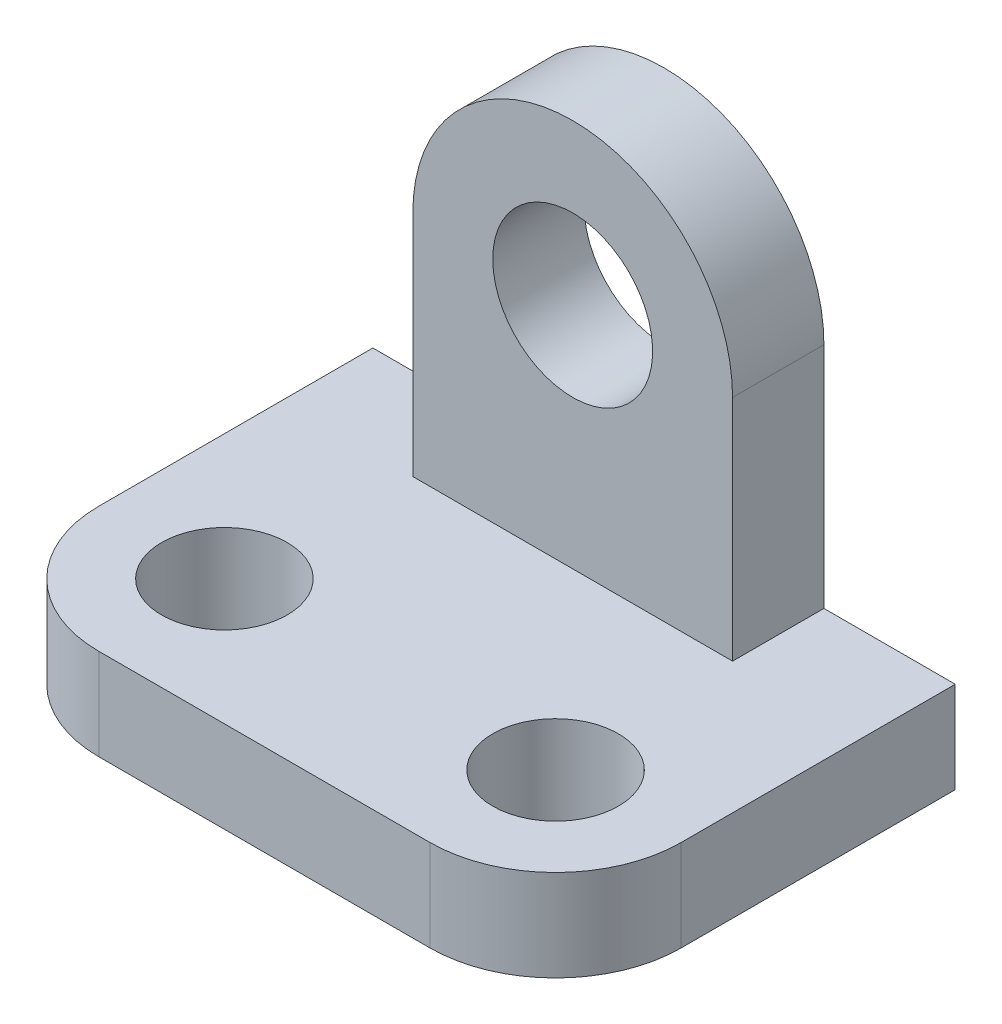
ISO-10303-21;
HEADER;
FILE_DESCRIPTION(('STEP AP214'),'2;1');
FILE_NAME('part.step','',(''),(''),'','','');
FILE_SCHEMA(('AUTOMOTIVE_DESIGN { 1 0 10303 214 1 1 1 1 }'));
ENDSEC;
DATA;
#1=APPLICATION_CONTEXT('core data for automotive mechanical design processes');
#2=APPLICATION_PROTOCOL_DEFINITION('international standard','automotive_design',2000,#1);
#3=PRODUCT_CONTEXT('',#1,'mechanical');
#4=PRODUCT('Part','Part','',(#3));
#5=PRODUCT_RELATED_PRODUCT_CATEGORY('part','',(#4));
#6=PRODUCT_DEFINITION_FORMATION('','',#4);
#7=PRODUCT_DEFINITION_CONTEXT('part definition',#1,'design');
#8=PRODUCT_DEFINITION('design','',#6,#7);
#9=PRODUCT_DEFINITION_SHAPE('','',#8);
#10=(LENGTH_UNIT() NAMED_UNIT(*) SI_UNIT(.MILLI.,.METRE.));
#11=(NAMED_UNIT(*) PLANE_ANGLE_UNIT() SI_UNIT($,.RADIAN.));
#12=(NAMED_UNIT(*) SI_UNIT($,.STERADIAN.) SOLID_ANGLE_UNIT());
#13=UNCERTAINTY_MEASURE_WITH_UNIT(LENGTH_MEASURE(1.E-05),#10,'distance_accuracy_value','');
#14=(GEOMETRIC_REPRESENTATION_CONTEXT(3) GLOBAL_UNCERTAINTY_ASSIGNED_CONTEXT((#13)) GLOBAL_UNIT_ASSIGNED_CONTEXT((#10,
#11,#12)) REPRESENTATION_CONTEXT('',''));
#15=CARTESIAN_POINT('',(0.,0.,0.));
#16=DIRECTION('',(0.,0.,1.));
#17=DIRECTION('',(1.,0.,0.));
#18=AXIS2_PLACEMENT_3D('',#15,#16,#17);
#19=CARTESIAN_POINT('',(-14.5,8.,6.50000000000002));
#20=DIRECTION('',(0.,-1.,0.));
#21=DIRECTION('',(0.,0.,-1.));
#22=AXIS2_PLACEMENT_3D('',#19,#20,#21);
#23=PLANE('',#22);
#24=CARTESIAN_POINT('',(-14.5,8.,6.49999999999995));
#25=DIRECTION('',(0.,1.,0.));
#26=DIRECTION('',(0.,0.,-1.));
#27=AXIS2_PLACEMENT_3D('',#24,#25,#26);
#28=CIRCLE('',#27,5.5);
#29=CARTESIAN_POINT('',(-14.5,8.,0.999999999999951));
#30=VERTEX_POINT('',#29);
#31=EDGE_CURVE('E266',#30,#30,#28,.T.);
#32=ORIENTED_EDGE('',*,*,#31,.F.);
#33=EDGE_LOOP('',(#32));
#34=FACE_BOUND('',#33,.T.);
#35=CARTESIAN_POINT('',(14.5,8.,6.49999999999995));
#36=DIRECTION('',(0.,1.,0.));
#37=DIRECTION('',(0.,0.,1.));
#38=AXIS2_PLACEMENT_3D('',#35,#36,#37);
#39=CIRCLE('',#38,5.49999999999999);
#40=CARTESIAN_POINT('',(14.5,8.,11.9999999999999));
#41=VERTEX_POINT('',#40);
#42=EDGE_CURVE('E153',#41,#41,#39,.T.);
#43=ORIENTED_EDGE('',*,*,#42,.F.);
#44=EDGE_LOOP('',(#43));
#45=FACE_BOUND('',#44,.T.);
#46=DIRECTION('',(0.,0.,-1.));
#47=VECTOR('',#46,1.);
#48=CARTESIAN_POINT('',(14.,8.,-9.49999999999999));
#49=LINE('',#48,#47);
#50=CARTESIAN_POINT('',(14.,8.,-9.49999999999999));
#51=VERTEX_POINT('',#50);
#52=CARTESIAN_POINT('',(14.,8.,-17.5));
#53=VERTEX_POINT('',#52);
#54=EDGE_CURVE('E201',#51,#53,#49,.T.);
#55=ORIENTED_EDGE('',*,*,#54,.F.);
#56=DIRECTION('',(-1.,0.,0.));
#57=VECTOR('',#56,1.);
#58=CARTESIAN_POINT('',(14.,8.,-9.49999999999999));
#59=LINE('',#58,#57);
#60=CARTESIAN_POINT('',(-14.,8.,-9.49999999999999));
#61=VERTEX_POINT('',#60);
#62=EDGE_CURVE('E235',#51,#61,#59,.T.);
#63=ORIENTED_EDGE('',*,*,#62,.T.);
#64=DIRECTION('',(0.,0.,-1.));
#65=VECTOR('',#64,1.);
#66=CARTESIAN_POINT('',(-14.,8.,-9.49999999999999));
#67=LINE('',#66,#65);
#68=CARTESIAN_POINT('',(-14.,8.,-17.5));
#69=VERTEX_POINT('',#68);
#70=EDGE_CURVE('E261',#61,#69,#67,.T.);
#71=ORIENTED_EDGE('',*,*,#70,.T.);
#72=DIRECTION('',(-1.,0.,0.));
#73=VECTOR('',#72,1.);
#74=CARTESIAN_POINT('',(-25.5,8.,-17.5));
#75=LINE('',#74,#73);
#76=CARTESIAN_POINT('',(-25.5,8.,-17.5));
#77=VERTEX_POINT('',#76);
#78=EDGE_CURVE('E188',#69,#77,#75,.T.);
#79=ORIENTED_EDGE('',*,*,#78,.T.);
#80=DIRECTION('',(0.,0.,1.));
#81=VECTOR('',#80,1.);
#82=CARTESIAN_POINT('',(-25.5,8.,6.50000000000002));
#83=LINE('',#82,#81);
#84=CARTESIAN_POINT('',(-25.5,8.,6.50000000000002));
#85=VERTEX_POINT('',#84);
#86=EDGE_CURVE('E123',#77,#85,#83,.T.);
#87=ORIENTED_EDGE('',*,*,#86,.T.);
#88=CARTESIAN_POINT('',(-14.5,8.,6.50000000000002));
#89=DIRECTION('',(0.,1.,0.));
#90=DIRECTION('',(0.,0.,-1.));
#91=AXIS2_PLACEMENT_3D('',#88,#89,#90);
#92=CIRCLE('',#91,11.);
#93=CARTESIAN_POINT('',(-14.5,8.,17.5));
#94=VERTEX_POINT('',#93);
#95=EDGE_CURVE('E116',#85,#94,#92,.T.);
#96=ORIENTED_EDGE('',*,*,#95,.T.);
#97=DIRECTION('',(1.,0.,0.));
#98=VECTOR('',#97,1.);
#99=CARTESIAN_POINT('',(-14.5,8.,17.5));
#100=LINE('',#99,#98);
#101=CARTESIAN_POINT('',(14.5,8.,17.5));
#102=VERTEX_POINT('',#101);
#103=EDGE_CURVE('E120',#94,#102,#100,.T.);
#104=ORIENTED_EDGE('',*,*,#103,.T.);
#105=CARTESIAN_POINT('',(14.5,8.,6.50000000000002));
#106=DIRECTION('',(0.,1.,0.));
#107=DIRECTION('',(0.,0.,1.));
#108=AXIS2_PLACEMENT_3D('',#105,#106,#107);
#109=CIRCLE('',#108,11.);
#110=CARTESIAN_POINT('',(25.5,8.,6.50000000000002));
#111=VERTEX_POINT('',#110);
#112=EDGE_CURVE('E70',#102,#111,#109,.T.);
#113=ORIENTED_EDGE('',*,*,#112,.T.);
#114=DIRECTION('',(0.,0.,-1.));
#115=VECTOR('',#114,1.);
#116=CARTESIAN_POINT('',(25.5,8.,6.50000000000002));
#117=LINE('',#116,#115);
#118=CARTESIAN_POINT('',(25.5,8.,-17.5));
#119=VERTEX_POINT('',#118);
#120=EDGE_CURVE('E166',#111,#119,#117,.T.);
#121=ORIENTED_EDGE('',*,*,#120,.T.);
#122=EDGE_CURVE('E105',#119,#53,#75,.T.);
#123=ORIENTED_EDGE('',*,*,#122,.T.);
#124=EDGE_LOOP('',(#55,#63,#71,#79,#87,#96,#104,#113,#121,#123));
#125=FACE_BOUND('',#124,.T.);
#126=ADVANCED_FACE('F45',(#34,#45,#125),#23,.F.);
#127=CARTESIAN_POINT('',(-14.5,0.,6.50000000000002));
#128=DIRECTION('',(0.,-1.,0.));
#129=DIRECTION('',(0.,0.,-1.));
#130=AXIS2_PLACEMENT_3D('',#127,#128,#129);
#131=PLANE('',#130);
#132=CARTESIAN_POINT('',(14.5,0.,6.49999999999995));
#133=DIRECTION('',(0.,1.,0.));
#134=DIRECTION('',(0.,0.,1.));
#135=AXIS2_PLACEMENT_3D('',#132,#133,#134);
#136=CIRCLE('',#135,5.49999999999999);
#137=CARTESIAN_POINT('',(14.5,0.,11.9999999999999));
#138=VERTEX_POINT('',#137);
#139=EDGE_CURVE('E193',#138,#138,#136,.T.);
#140=ORIENTED_EDGE('',*,*,#139,.T.);
#141=EDGE_LOOP('',(#140));
#142=FACE_BOUND('',#141,.T.);
#143=DIRECTION('',(0.,0.,-1.));
#144=VECTOR('',#143,1.);
#145=CARTESIAN_POINT('',(25.5,0.,6.50000000000002));
#146=LINE('',#145,#144);
#147=CARTESIAN_POINT('',(25.5,0.,6.50000000000002));
#148=VERTEX_POINT('',#147);
#149=CARTESIAN_POINT('',(25.5,0.,-17.5));
#150=VERTEX_POINT('',#149);
#151=EDGE_CURVE('E148',#148,#150,#146,.T.);
#152=ORIENTED_EDGE('',*,*,#151,.F.);
#153=CARTESIAN_POINT('',(14.5,0.,6.50000000000002));
#154=DIRECTION('',(0.,1.,0.));
#155=DIRECTION('',(0.,0.,1.));
#156=AXIS2_PLACEMENT_3D('',#153,#154,#155);
#157=CIRCLE('',#156,11.);
#158=CARTESIAN_POINT('',(14.5,0.,17.5));
#159=VERTEX_POINT('',#158);
#160=EDGE_CURVE('E97',#159,#148,#157,.T.);
#161=ORIENTED_EDGE('',*,*,#160,.F.);
#162=DIRECTION('',(1.,0.,0.));
#163=VECTOR('',#162,1.);
#164=CARTESIAN_POINT('',(-14.5,0.,17.5));
#165=LINE('',#164,#163);
#166=CARTESIAN_POINT('',(-14.5,0.,17.5));
#167=VERTEX_POINT('',#166);
#168=EDGE_CURVE('E161',#167,#159,#165,.T.);
#169=ORIENTED_EDGE('',*,*,#168,.F.);
#170=CARTESIAN_POINT('',(-14.5,0.,6.50000000000002));
#171=DIRECTION('',(0.,1.,0.));
#172=DIRECTION('',(0.,0.,-1.));
#173=AXIS2_PLACEMENT_3D('',#170,#171,#172);
#174=CIRCLE('',#173,11.);
#175=CARTESIAN_POINT('',(-25.5,0.,6.50000000000002));
#176=VERTEX_POINT('',#175);
#177=EDGE_CURVE('E133',#176,#167,#174,.T.);
#178=ORIENTED_EDGE('',*,*,#177,.F.);
#179=DIRECTION('',(0.,0.,1.));
#180=VECTOR('',#179,1.);
#181=CARTESIAN_POINT('',(-25.5,0.,6.50000000000002));
#182=LINE('',#181,#180);
#183=CARTESIAN_POINT('',(-25.5,0.,-17.5));
#184=VERTEX_POINT('',#183);
#185=EDGE_CURVE('E156',#184,#176,#182,.T.);
#186=ORIENTED_EDGE('',*,*,#185,.F.);
#187=DIRECTION('',(-1.,0.,0.));
#188=VECTOR('',#187,1.);
#189=CARTESIAN_POINT('',(-25.5,0.,-17.5));
#190=LINE('',#189,#188);
#191=EDGE_CURVE('E152',#150,#184,#190,.T.);
#192=ORIENTED_EDGE('',*,*,#191,.F.);
#193=EDGE_LOOP('',(#152,#161,#169,#178,#186,#192));
#194=FACE_BOUND('',#193,.T.);
#195=CARTESIAN_POINT('',(-14.5,0.,6.49999999999995));
#196=DIRECTION('',(0.,1.,0.));
#197=DIRECTION('',(0.,0.,-1.));
#198=AXIS2_PLACEMENT_3D('',#195,#196,#197);
#199=CIRCLE('',#198,5.5);
#200=CARTESIAN_POINT('',(-14.5,0.,0.999999999999951));
#201=VERTEX_POINT('',#200);
#202=EDGE_CURVE('E260',#201,#201,#199,.T.);
#203=ORIENTED_EDGE('',*,*,#202,.T.);
#204=EDGE_LOOP('',(#203));
#205=FACE_BOUND('',#204,.T.);
#206=ADVANCED_FACE('F181',(#142,#194,#205),#131,.T.);
#207=CARTESIAN_POINT('',(25.5,8.,6.50000000000002));
#208=DIRECTION('',(-1.,0.,0.));
#209=DIRECTION('',(0.,0.,1.));
#210=AXIS2_PLACEMENT_3D('',#207,#208,#209);
#211=PLANE('',#210);
#212=ORIENTED_EDGE('',*,*,#151,.T.);
#213=DIRECTION('',(0.,-1.,0.));
#214=VECTOR('',#213,1.);
#215=CARTESIAN_POINT('',(25.5,8.,-17.5));
#216=LINE('',#215,#214);
#217=EDGE_CURVE('E11',#119,#150,#216,.T.);
#218=ORIENTED_EDGE('',*,*,#217,.F.);
#219=ORIENTED_EDGE('',*,*,#120,.F.);
#220=DIRECTION('',(0.,-1.,0.));
#221=VECTOR('',#220,1.);
#222=CARTESIAN_POINT('',(25.5,8.,6.50000000000002));
#223=LINE('',#222,#221);
#224=EDGE_CURVE('E144',#111,#148,#223,.T.);
#225=ORIENTED_EDGE('',*,*,#224,.T.);
#226=EDGE_LOOP('',(#212,#218,#219,#225));
#227=FACE_BOUND('',#226,.T.);
#228=ADVANCED_FACE('F47',(#227),#211,.F.);
#229=CARTESIAN_POINT('',(-25.5,8.,-17.5));
#230=DIRECTION('',(0.,0.,1.));
#231=DIRECTION('',(1.,0.,0.));
#232=AXIS2_PLACEMENT_3D('',#229,#230,#231);
#233=PLANE('',#232);
#234=ORIENTED_EDGE('',*,*,#191,.T.);
#235=DIRECTION('',(0.,-1.,0.));
#236=VECTOR('',#235,1.);
#237=CARTESIAN_POINT('',(-25.5,8.,-17.5));
#238=LINE('',#237,#236);
#239=EDGE_CURVE('E54',#77,#184,#238,.T.);
#240=ORIENTED_EDGE('',*,*,#239,.F.);
#241=ORIENTED_EDGE('',*,*,#78,.F.);
#242=DIRECTION('',(0.,1.,0.));
#243=VECTOR('',#242,1.);
#244=CARTESIAN_POINT('',(-14.,8.,-17.5));
#245=LINE('',#244,#243);
#246=CARTESIAN_POINT('',(-14.,28.,-17.5));
#247=VERTEX_POINT('',#246);
#248=EDGE_CURVE('E61',#69,#247,#245,.T.);
#249=ORIENTED_EDGE('',*,*,#248,.T.);
#250=CARTESIAN_POINT('',(0.,28.,-17.5));
#251=DIRECTION('',(0.,0.,-1.));
#252=DIRECTION('',(-1.,0.,0.));
#253=AXIS2_PLACEMENT_3D('',#250,#251,#252);
#254=CIRCLE('',#253,14.);
#255=CARTESIAN_POINT('',(14.,28.,-17.5));
#256=VERTEX_POINT('',#255);
#257=EDGE_CURVE('E252',#247,#256,#254,.T.);
#258=ORIENTED_EDGE('',*,*,#257,.T.);
#259=DIRECTION('',(0.,-1.,0.));
#260=VECTOR('',#259,1.);
#261=CARTESIAN_POINT('',(14.,8.,-17.5));
#262=LINE('',#261,#260);
#263=EDGE_CURVE('E221',#256,#53,#262,.T.);
#264=ORIENTED_EDGE('',*,*,#263,.T.);
#265=ORIENTED_EDGE('',*,*,#122,.F.);
#266=ORIENTED_EDGE('',*,*,#217,.T.);
#267=EDGE_LOOP('',(#234,#240,#241,#249,#258,#264,#265,#266));
#268=FACE_BOUND('',#267,.T.);
#269=CARTESIAN_POINT('',(0.,28.,-17.5));
#270=DIRECTION('',(0.,0.,-1.));
#271=DIRECTION('',(-1.,0.,0.));
#272=AXIS2_PLACEMENT_3D('',#269,#270,#271);
#273=CIRCLE('',#272,7.);
#274=CARTESIAN_POINT('',(-7.,28.,-17.5));
#275=VERTEX_POINT('',#274);
#276=EDGE_CURVE('E245',#275,#275,#273,.T.);
#277=ORIENTED_EDGE('',*,*,#276,.F.);
#278=EDGE_LOOP('',(#277));
#279=FACE_BOUND('',#278,.T.);
#280=ADVANCED_FACE('F308',(#268,#279),#233,.F.);
#281=CARTESIAN_POINT('',(-25.5,8.,6.50000000000002));
#282=DIRECTION('',(1.,0.,0.));
#283=DIRECTION('',(0.,0.,-1.));
#284=AXIS2_PLACEMENT_3D('',#281,#282,#283);
#285=PLANE('',#284);
#286=ORIENTED_EDGE('',*,*,#185,.T.);
#287=DIRECTION('',(0.,-1.,0.));
#288=VECTOR('',#287,1.);
#289=CARTESIAN_POINT('',(-25.5,8.,6.50000000000002));
#290=LINE('',#289,#288);
#291=EDGE_CURVE('E137',#85,#176,#290,.T.);
#292=ORIENTED_EDGE('',*,*,#291,.F.);
#293=ORIENTED_EDGE('',*,*,#86,.F.);
#294=ORIENTED_EDGE('',*,*,#239,.T.);
#295=EDGE_LOOP('',(#286,#292,#293,#294));
#296=FACE_BOUND('',#295,.T.);
#297=ADVANCED_FACE('F177',(#296),#285,.F.);
#298=CARTESIAN_POINT('',(-14.5,8.,6.50000000000002));
#299=DIRECTION('',(0.,-1.,0.));
#300=DIRECTION('',(0.,0.,-1.));
#301=AXIS2_PLACEMENT_3D('',#298,#299,#300);
#302=CYLINDRICAL_SURFACE('',#301,11.);
#303=ORIENTED_EDGE('',*,*,#177,.T.);
#304=DIRECTION('',(0.,-1.,0.));
#305=VECTOR('',#304,1.);
#306=CARTESIAN_POINT('',(-14.5,8.,17.5));
#307=LINE('',#306,#305);
#308=EDGE_CURVE('E130',#94,#167,#307,.T.);
#309=ORIENTED_EDGE('',*,*,#308,.F.);
#310=ORIENTED_EDGE('',*,*,#95,.F.);
#311=ORIENTED_EDGE('',*,*,#291,.T.);
#312=EDGE_LOOP('',(#303,#309,#310,#311));
#313=FACE_BOUND('',#312,.T.);
#314=ADVANCED_FACE('F131',(#313),#302,.T.);
#315=CARTESIAN_POINT('',(-14.5,8.,17.5));
#316=DIRECTION('',(0.,0.,-1.));
#317=DIRECTION('',(-1.,0.,0.));
#318=AXIS2_PLACEMENT_3D('',#315,#316,#317);
#319=PLANE('',#318);
#320=ORIENTED_EDGE('',*,*,#168,.T.);
#321=DIRECTION('',(0.,-1.,0.));
#322=VECTOR('',#321,1.);
#323=CARTESIAN_POINT('',(14.5,8.,17.5));
#324=LINE('',#323,#322);
#325=EDGE_CURVE('E138',#102,#159,#324,.T.);
#326=ORIENTED_EDGE('',*,*,#325,.F.);
#327=ORIENTED_EDGE('',*,*,#103,.F.);
#328=ORIENTED_EDGE('',*,*,#308,.T.);
#329=EDGE_LOOP('',(#320,#326,#327,#328));
#330=FACE_BOUND('',#329,.T.);
#331=ADVANCED_FACE('F140',(#330),#319,.F.);
#332=CARTESIAN_POINT('',(14.5,8.,6.50000000000002));
#333=DIRECTION('',(0.,-1.,0.));
#334=DIRECTION('',(0.,0.,-1.));
#335=AXIS2_PLACEMENT_3D('',#332,#333,#334);
#336=CYLINDRICAL_SURFACE('',#335,11.);
#337=ORIENTED_EDGE('',*,*,#160,.T.);
#338=ORIENTED_EDGE('',*,*,#224,.F.);
#339=ORIENTED_EDGE('',*,*,#112,.F.);
#340=ORIENTED_EDGE('',*,*,#325,.T.);
#341=EDGE_LOOP('',(#337,#338,#339,#340));
#342=FACE_BOUND('',#341,.T.);
#343=ADVANCED_FACE('F183',(#342),#336,.T.);
#344=CARTESIAN_POINT('',(14.5,8.,6.49999999999995));
#345=DIRECTION('',(0.,-1.,0.));
#346=DIRECTION('',(0.,0.,-1.));
#347=AXIS2_PLACEMENT_3D('',#344,#345,#346);
#348=CYLINDRICAL_SURFACE('',#347,5.49999999999999);
#349=ORIENTED_EDGE('',*,*,#42,.T.);
#350=EDGE_LOOP('',(#349));
#351=FACE_BOUND('',#350,.T.);
#352=ORIENTED_EDGE('',*,*,#139,.F.);
#353=EDGE_LOOP('',(#352));
#354=FACE_BOUND('',#353,.T.);
#355=ADVANCED_FACE('F281',(#351,#354),#348,.F.);
#356=CARTESIAN_POINT('',(-14.5,8.,6.49999999999995));
#357=DIRECTION('',(0.,-1.,0.));
#358=DIRECTION('',(0.,0.,-1.));
#359=AXIS2_PLACEMENT_3D('',#356,#357,#358);
#360=CYLINDRICAL_SURFACE('',#359,5.5);
#361=ORIENTED_EDGE('',*,*,#31,.T.);
#362=EDGE_LOOP('',(#361));
#363=FACE_BOUND('',#362,.T.);
#364=ORIENTED_EDGE('',*,*,#202,.F.);
#365=EDGE_LOOP('',(#364));
#366=FACE_BOUND('',#365,.T.);
#367=ADVANCED_FACE('F283',(#363,#366),#360,.F.);
#368=CARTESIAN_POINT('',(0.,28.,-9.49999999999999));
#369=DIRECTION('',(0.,0.,-1.));
#370=DIRECTION('',(-1.,0.,0.));
#371=AXIS2_PLACEMENT_3D('',#368,#369,#370);
#372=CYLINDRICAL_SURFACE('',#371,14.);
#373=ORIENTED_EDGE('',*,*,#257,.F.);
#374=DIRECTION('',(0.,0.,-1.));
#375=VECTOR('',#374,1.);
#376=CARTESIAN_POINT('',(-14.,28.,-9.49999999999999));
#377=LINE('',#376,#375);
#378=CARTESIAN_POINT('',(-14.,28.,-9.49999999999999));
#379=VERTEX_POINT('',#378);
#380=EDGE_CURVE('E239',#379,#247,#377,.T.);
#381=ORIENTED_EDGE('',*,*,#380,.F.);
#382=CARTESIAN_POINT('',(0.,28.,-9.49999999999999));
#383=DIRECTION('',(0.,0.,-1.));
#384=DIRECTION('',(-1.,0.,0.));
#385=AXIS2_PLACEMENT_3D('',#382,#383,#384);
#386=CIRCLE('',#385,14.);
#387=CARTESIAN_POINT('',(14.,28.,-9.49999999999999));
#388=VERTEX_POINT('',#387);
#389=EDGE_CURVE('E233',#379,#388,#386,.T.);
#390=ORIENTED_EDGE('',*,*,#389,.T.);
#391=DIRECTION('',(0.,0.,-1.));
#392=VECTOR('',#391,1.);
#393=CARTESIAN_POINT('',(14.,28.,-9.49999999999999));
#394=LINE('',#393,#392);
#395=EDGE_CURVE('E217',#388,#256,#394,.T.);
#396=ORIENTED_EDGE('',*,*,#395,.T.);
#397=EDGE_LOOP('',(#373,#381,#390,#396));
#398=FACE_BOUND('',#397,.T.);
#399=ADVANCED_FACE('F238',(#398),#372,.T.);
#400=CARTESIAN_POINT('',(-14.,8.,-9.49999999999999));
#401=DIRECTION('',(-1.,0.,0.));
#402=DIRECTION('',(0.,0.,1.));
#403=AXIS2_PLACEMENT_3D('',#400,#401,#402);
#404=PLANE('',#403);
#405=ORIENTED_EDGE('',*,*,#248,.F.);
#406=ORIENTED_EDGE('',*,*,#70,.F.);
#407=DIRECTION('',(0.,1.,0.));
#408=VECTOR('',#407,1.);
#409=CARTESIAN_POINT('',(-14.,8.,-9.49999999999999));
#410=LINE('',#409,#408);
#411=EDGE_CURVE('E227',#61,#379,#410,.T.);
#412=ORIENTED_EDGE('',*,*,#411,.T.);
#413=ORIENTED_EDGE('',*,*,#380,.T.);
#414=EDGE_LOOP('',(#405,#406,#412,#413));
#415=FACE_BOUND('',#414,.T.);
#416=ADVANCED_FACE('F331',(#415),#404,.T.);
#417=CARTESIAN_POINT('',(14.,8.,-9.49999999999999));
#418=DIRECTION('',(1.,0.,0.));
#419=DIRECTION('',(0.,0.,-1.));
#420=AXIS2_PLACEMENT_3D('',#417,#418,#419);
#421=PLANE('',#420);
#422=ORIENTED_EDGE('',*,*,#263,.F.);
#423=ORIENTED_EDGE('',*,*,#395,.F.);
#424=DIRECTION('',(0.,-1.,0.));
#425=VECTOR('',#424,1.);
#426=CARTESIAN_POINT('',(14.,8.,-9.49999999999999));
#427=LINE('',#426,#425);
#428=EDGE_CURVE('E220',#388,#51,#427,.T.);
#429=ORIENTED_EDGE('',*,*,#428,.T.);
#430=ORIENTED_EDGE('',*,*,#54,.T.);
#431=EDGE_LOOP('',(#422,#423,#429,#430));
#432=FACE_BOUND('',#431,.T.);
#433=ADVANCED_FACE('F219',(#432),#421,.T.);
#434=CARTESIAN_POINT('',(0.,28.,-9.49999999999999));
#435=DIRECTION('',(0.,0.,-1.));
#436=DIRECTION('',(-1.,0.,0.));
#437=AXIS2_PLACEMENT_3D('',#434,#435,#436);
#438=PLANE('',#437);
#439=CARTESIAN_POINT('',(0.,28.,-9.49999999999999));
#440=DIRECTION('',(0.,0.,-1.));
#441=DIRECTION('',(-1.,0.,0.));
#442=AXIS2_PLACEMENT_3D('',#439,#440,#441);
#443=CIRCLE('',#442,7.);
#444=CARTESIAN_POINT('',(-7.,28.,-9.49999999999999));
#445=VERTEX_POINT('',#444);
#446=EDGE_CURVE('E255',#445,#445,#443,.T.);
#447=ORIENTED_EDGE('',*,*,#446,.T.);
#448=EDGE_LOOP('',(#447));
#449=FACE_BOUND('',#448,.T.);
#450=ORIENTED_EDGE('',*,*,#389,.F.);
#451=ORIENTED_EDGE('',*,*,#411,.F.);
#452=ORIENTED_EDGE('',*,*,#62,.F.);
#453=ORIENTED_EDGE('',*,*,#428,.F.);
#454=EDGE_LOOP('',(#450,#451,#452,#453));
#455=FACE_BOUND('',#454,.T.);
#456=ADVANCED_FACE('F231',(#449,#455),#438,.F.);
#457=CARTESIAN_POINT('',(0.,28.,-9.49999999999999));
#458=DIRECTION('',(0.,0.,-1.));
#459=DIRECTION('',(-1.,0.,0.));
#460=AXIS2_PLACEMENT_3D('',#457,#458,#459);
#461=CYLINDRICAL_SURFACE('',#460,7.);
#462=ORIENTED_EDGE('',*,*,#446,.F.);
#463=EDGE_LOOP('',(#462));
#464=FACE_BOUND('',#463,.T.);
#465=ORIENTED_EDGE('',*,*,#276,.T.);
#466=EDGE_LOOP('',(#465));
#467=FACE_BOUND('',#466,.T.);
#468=ADVANCED_FACE('F323',(#464,#467),#461,.F.);
#469=CLOSED_SHELL('',(#126,#206,#228,#280,#297,#314,#331,#343,#355,#367,#399,#416,#433,#456,#468));
#470=MANIFOLD_SOLID_BREP('B2',#469);
#471=ADVANCED_BREP_SHAPE_REPRESENTATION('',(#18,#470),#14);
#472=SHAPE_DEFINITION_REPRESENTATION(#9,#471);
ENDSEC;
END-ISO-10303-21;
